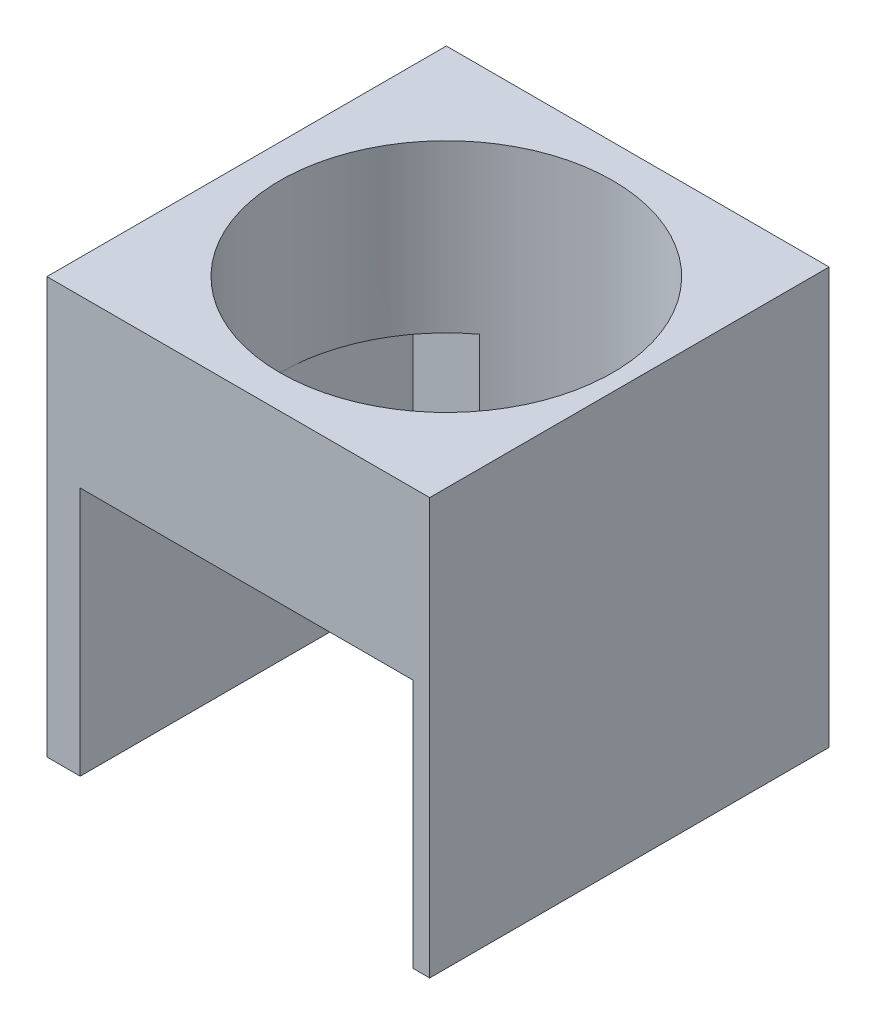
ISO-10303-21;
HEADER;
FILE_DESCRIPTION(('STEP AP214'),'2;1');
FILE_NAME('part.step','',(''),(''),'','','');
FILE_SCHEMA(('AUTOMOTIVE_DESIGN { 1 0 10303 214 1 1 1 1 }'));
ENDSEC;
DATA;
#1=APPLICATION_CONTEXT('core data for automotive mechanical design processes');
#2=APPLICATION_PROTOCOL_DEFINITION('international standard','automotive_design',2000,#1);
#3=PRODUCT_CONTEXT('',#1,'mechanical');
#4=PRODUCT('Part','Part','',(#3));
#5=PRODUCT_RELATED_PRODUCT_CATEGORY('part','',(#4));
#6=PRODUCT_DEFINITION_FORMATION('','',#4);
#7=PRODUCT_DEFINITION_CONTEXT('part definition',#1,'design');
#8=PRODUCT_DEFINITION('design','',#6,#7);
#9=PRODUCT_DEFINITION_SHAPE('','',#8);
#10=(LENGTH_UNIT() NAMED_UNIT(*) SI_UNIT(.MILLI.,.METRE.));
#11=(NAMED_UNIT(*) PLANE_ANGLE_UNIT() SI_UNIT($,.RADIAN.));
#12=(NAMED_UNIT(*) SI_UNIT($,.STERADIAN.) SOLID_ANGLE_UNIT());
#13=UNCERTAINTY_MEASURE_WITH_UNIT(LENGTH_MEASURE(1.E-05),#10,'distance_accuracy_value','');
#14=(GEOMETRIC_REPRESENTATION_CONTEXT(3) GLOBAL_UNCERTAINTY_ASSIGNED_CONTEXT((#13)) GLOBAL_UNIT_ASSIGNED_CONTEXT((#10,
#11,#12)) REPRESENTATION_CONTEXT('',''));
#15=CARTESIAN_POINT('',(0.,0.,0.));
#16=DIRECTION('',(0.,0.,1.));
#17=DIRECTION('',(1.,0.,0.));
#18=AXIS2_PLACEMENT_3D('',#15,#16,#17);
#19=CARTESIAN_POINT('',(0.,530.,0.));
#20=DIRECTION('',(0.,0.,-1.));
#21=DIRECTION('',(-1.,0.,0.));
#22=AXIS2_PLACEMENT_3D('',#19,#20,#21);
#23=PLANE('',#22);
#24=DIRECTION('',(0.,-1.,0.));
#25=VECTOR('',#24,1.);
#26=CARTESIAN_POINT('',(0.,530.,0.));
#27=LINE('',#26,#25);
#28=CARTESIAN_POINT('',(0.,530.,0.));
#29=VERTEX_POINT('',#28);
#30=CARTESIAN_POINT('',(0.,405.,0.));
#31=VERTEX_POINT('',#30);
#32=EDGE_CURVE('E143',#29,#31,#27,.T.);
#33=ORIENTED_EDGE('',*,*,#32,.T.);
#34=DIRECTION('',(1.,0.,0.));
#35=VECTOR('',#34,1.);
#36=CARTESIAN_POINT('',(0.,405.,0.));
#37=LINE('',#36,#35);
#38=CARTESIAN_POINT('',(9.99999999999982,405.,0.));
#39=VERTEX_POINT('',#38);
#40=EDGE_CURVE('E124',#31,#39,#37,.T.);
#41=ORIENTED_EDGE('',*,*,#40,.T.);
#42=DIRECTION('',(0.,-1.,0.));
#43=VECTOR('',#42,1.);
#44=CARTESIAN_POINT('',(9.99999999999982,280.,0.));
#45=LINE('',#44,#43);
#46=CARTESIAN_POINT('',(9.99999999999982,480.,0.));
#47=VERTEX_POINT('',#46);
#48=EDGE_CURVE('E186',#47,#39,#45,.T.);
#49=ORIENTED_EDGE('',*,*,#48,.F.);
#50=DIRECTION('',(-1.,0.,0.));
#51=VECTOR('',#50,1.);
#52=CARTESIAN_POINT('',(9.99999999999982,480.,0.));
#53=LINE('',#52,#51);
#54=CARTESIAN_POINT('',(110.,480.,0.));
#55=VERTEX_POINT('',#54);
#56=EDGE_CURVE('E200',#55,#47,#53,.T.);
#57=ORIENTED_EDGE('',*,*,#56,.F.);
#58=DIRECTION('',(0.,1.,0.));
#59=VECTOR('',#58,1.);
#60=CARTESIAN_POINT('',(110.,280.,0.));
#61=LINE('',#60,#59);
#62=CARTESIAN_POINT('',(110.,405.,0.));
#63=VERTEX_POINT('',#62);
#64=EDGE_CURVE('E194',#63,#55,#61,.T.);
#65=ORIENTED_EDGE('',*,*,#64,.F.);
#66=CARTESIAN_POINT('',(115.,405.,0.));
#67=VERTEX_POINT('',#66);
#68=EDGE_CURVE('E227',#63,#67,#37,.T.);
#69=ORIENTED_EDGE('',*,*,#68,.T.);
#70=DIRECTION('',(0.,1.,0.));
#71=VECTOR('',#70,1.);
#72=CARTESIAN_POINT('',(115.,530.,0.));
#73=LINE('',#72,#71);
#74=CARTESIAN_POINT('',(115.,530.,0.));
#75=VERTEX_POINT('',#74);
#76=EDGE_CURVE('E181',#67,#75,#73,.T.);
#77=ORIENTED_EDGE('',*,*,#76,.T.);
#78=DIRECTION('',(1.,0.,0.));
#79=VECTOR('',#78,1.);
#80=CARTESIAN_POINT('',(0.,530.,0.));
#81=LINE('',#80,#79);
#82=EDGE_CURVE('E148',#29,#75,#81,.T.);
#83=ORIENTED_EDGE('',*,*,#82,.F.);
#84=EDGE_LOOP('',(#33,#41,#49,#57,#65,#69,#77,#83));
#85=FACE_BOUND('',#84,.T.);
#86=ADVANCED_FACE('F38',(#85),#23,.F.);
#87=CARTESIAN_POINT('',(9.99999999999982,480.,-100.));
#88=DIRECTION('',(0.,1.,0.));
#89=DIRECTION('',(-1.,0.,0.));
#90=AXIS2_PLACEMENT_3D('',#87,#88,#89);
#91=PLANE('',#90);
#92=DIRECTION('',(0.,0.,1.));
#93=VECTOR('',#92,1.);
#94=CARTESIAN_POINT('',(110.,480.,-100.));
#95=LINE('',#94,#93);
#96=CARTESIAN_POINT('',(110.,480.,-100.));
#97=VERTEX_POINT('',#96);
#98=CARTESIAN_POINT('',(110.,480.,-60.));
#99=VERTEX_POINT('',#98);
#100=EDGE_CURVE('E172',#97,#99,#95,.T.);
#101=ORIENTED_EDGE('',*,*,#100,.T.);
#102=CARTESIAN_POINT('',(60.,480.,-60.));
#103=DIRECTION('',(0.,1.,0.));
#104=DIRECTION('',(-1.,0.,0.));
#105=AXIS2_PLACEMENT_3D('',#102,#103,#104);
#106=CIRCLE('',#105,50.);
#107=CARTESIAN_POINT('',(90.0000000000001,480.,-100.));
#108=VERTEX_POINT('',#107);
#109=EDGE_CURVE('E166',#99,#108,#106,.T.);
#110=ORIENTED_EDGE('',*,*,#109,.T.);
#111=DIRECTION('',(-1.,0.,0.));
#112=VECTOR('',#111,1.);
#113=CARTESIAN_POINT('',(9.99999999999982,480.,-100.));
#114=LINE('',#113,#112);
#115=EDGE_CURVE('E160',#97,#108,#114,.T.);
#116=ORIENTED_EDGE('',*,*,#115,.F.);
#117=EDGE_LOOP('',(#101,#110,#116));
#118=FACE_BOUND('',#117,.T.);
#119=ADVANCED_FACE('F170',(#118),#91,.F.);
#120=DIRECTION('',(0.,0.,1.));
#121=VECTOR('',#120,1.);
#122=CARTESIAN_POINT('',(9.99999999999982,480.,-100.));
#123=LINE('',#122,#121);
#124=CARTESIAN_POINT('',(9.99999999999982,480.,-60.));
#125=VERTEX_POINT('',#124);
#126=EDGE_CURVE('E213',#125,#47,#123,.T.);
#127=ORIENTED_EDGE('',*,*,#126,.F.);
#128=EDGE_CURVE('E174',#125,#99,#106,.T.);
#129=ORIENTED_EDGE('',*,*,#128,.T.);
#130=EDGE_CURVE('E216',#99,#55,#95,.T.);
#131=ORIENTED_EDGE('',*,*,#130,.T.);
#132=ORIENTED_EDGE('',*,*,#56,.T.);
#133=EDGE_LOOP('',(#127,#129,#131,#132));
#134=FACE_BOUND('',#133,.T.);
#135=ADVANCED_FACE('F262',(#134),#91,.F.);
#136=CARTESIAN_POINT('',(0.,0.,-100.));
#137=DIRECTION('',(0.,0.,-1.));
#138=DIRECTION('',(-1.,0.,0.));
#139=AXIS2_PLACEMENT_3D('',#136,#137,#138);
#140=PLANE('',#139);
#141=DIRECTION('',(0.,-1.,0.));
#142=VECTOR('',#141,1.);
#143=CARTESIAN_POINT('',(9.99999999999982,280.,-100.));
#144=LINE('',#143,#142);
#145=CARTESIAN_POINT('',(9.99999999999982,480.,-100.));
#146=VERTEX_POINT('',#145);
#147=CARTESIAN_POINT('',(9.99999999999982,405.,-100.));
#148=VERTEX_POINT('',#147);
#149=EDGE_CURVE('E208',#146,#148,#144,.T.);
#150=ORIENTED_EDGE('',*,*,#149,.T.);
#151=DIRECTION('',(1.,0.,0.));
#152=VECTOR('',#151,1.);
#153=CARTESIAN_POINT('',(0.,405.,-100.));
#154=LINE('',#153,#152);
#155=CARTESIAN_POINT('',(30.,405.,-100.));
#156=VERTEX_POINT('',#155);
#157=EDGE_CURVE('E242',#148,#156,#154,.T.);
#158=ORIENTED_EDGE('',*,*,#157,.T.);
#159=DIRECTION('',(0.,1.,0.));
#160=VECTOR('',#159,1.);
#161=CARTESIAN_POINT('',(30.,270.,-100.));
#162=LINE('',#161,#160);
#163=CARTESIAN_POINT('',(30.,480.,-100.));
#164=VERTEX_POINT('',#163);
#165=EDGE_CURVE('E11',#156,#164,#162,.T.);
#166=ORIENTED_EDGE('',*,*,#165,.T.);
#167=EDGE_CURVE('E265',#164,#146,#114,.T.);
#168=ORIENTED_EDGE('',*,*,#167,.T.);
#169=EDGE_LOOP('',(#150,#158,#166,#168));
#170=FACE_BOUND('',#169,.T.);
#171=ADVANCED_FACE('F272',(#170),#140,.F.);
#172=CARTESIAN_POINT('',(0.,530.,0.));
#173=DIRECTION('',(1.,0.,0.));
#174=DIRECTION('',(0.,0.,-1.));
#175=AXIS2_PLACEMENT_3D('',#172,#173,#174);
#176=PLANE('',#175);
#177=DIRECTION('',(0.,-1.,0.));
#178=VECTOR('',#177,1.);
#179=CARTESIAN_POINT('',(0.,530.,-120.));
#180=LINE('',#179,#178);
#181=CARTESIAN_POINT('',(0.,530.,-120.));
#182=VERTEX_POINT('',#181);
#183=CARTESIAN_POINT('',(0.,405.,-120.));
#184=VERTEX_POINT('',#183);
#185=EDGE_CURVE('E136',#182,#184,#180,.T.);
#186=ORIENTED_EDGE('',*,*,#185,.T.);
#187=DIRECTION('',(0.,0.,1.));
#188=VECTOR('',#187,1.);
#189=CARTESIAN_POINT('',(0.,405.,-120.));
#190=LINE('',#189,#188);
#191=EDGE_CURVE('E121',#184,#31,#190,.T.);
#192=ORIENTED_EDGE('',*,*,#191,.T.);
#193=ORIENTED_EDGE('',*,*,#32,.F.);
#194=DIRECTION('',(0.,0.,1.));
#195=VECTOR('',#194,1.);
#196=CARTESIAN_POINT('',(0.,530.,0.));
#197=LINE('',#196,#195);
#198=EDGE_CURVE('E141',#182,#29,#197,.T.);
#199=ORIENTED_EDGE('',*,*,#198,.F.);
#200=EDGE_LOOP('',(#186,#192,#193,#199));
#201=FACE_BOUND('',#200,.T.);
#202=ADVANCED_FACE('F40',(#201),#176,.F.);
#203=CARTESIAN_POINT('',(0.,530.,-120.));
#204=DIRECTION('',(0.,0.,1.));
#205=DIRECTION('',(1.,0.,0.));
#206=AXIS2_PLACEMENT_3D('',#203,#204,#205);
#207=PLANE('',#206);
#208=DIRECTION('',(0.,-1.,0.));
#209=VECTOR('',#208,1.);
#210=CARTESIAN_POINT('',(115.,280.,-120.));
#211=LINE('',#210,#209);
#212=CARTESIAN_POINT('',(115.,530.,-120.));
#213=VERTEX_POINT('',#212);
#214=CARTESIAN_POINT('',(115.,405.,-120.));
#215=VERTEX_POINT('',#214);
#216=EDGE_CURVE('E138',#213,#215,#211,.T.);
#217=ORIENTED_EDGE('',*,*,#216,.T.);
#218=DIRECTION('',(-1.,0.,0.));
#219=VECTOR('',#218,1.);
#220=CARTESIAN_POINT('',(0.,405.,-120.));
#221=LINE('',#220,#219);
#222=EDGE_CURVE('E54',#215,#184,#221,.T.);
#223=ORIENTED_EDGE('',*,*,#222,.T.);
#224=ORIENTED_EDGE('',*,*,#185,.F.);
#225=DIRECTION('',(-1.,0.,0.));
#226=VECTOR('',#225,1.);
#227=CARTESIAN_POINT('',(0.,530.,-120.));
#228=LINE('',#227,#226);
#229=EDGE_CURVE('E62',#213,#182,#228,.T.);
#230=ORIENTED_EDGE('',*,*,#229,.F.);
#231=EDGE_LOOP('',(#217,#223,#224,#230));
#232=FACE_BOUND('',#231,.T.);
#233=ADVANCED_FACE('F135',(#232),#207,.F.);
#234=CARTESIAN_POINT('',(0.,530.,0.));
#235=DIRECTION('',(0.,-1.,0.));
#236=DIRECTION('',(0.,0.,-1.));
#237=AXIS2_PLACEMENT_3D('',#234,#235,#236);
#238=PLANE('',#237);
#239=CARTESIAN_POINT('',(60.,530.,-60.));
#240=DIRECTION('',(0.,1.,0.));
#241=DIRECTION('',(0.,0.,1.));
#242=AXIS2_PLACEMENT_3D('',#239,#240,#241);
#243=CIRCLE('',#242,50.);
#244=CARTESIAN_POINT('',(60.,530.,-9.99999999999999));
#245=VERTEX_POINT('',#244);
#246=EDGE_CURVE('E175',#245,#245,#243,.T.);
#247=ORIENTED_EDGE('',*,*,#246,.F.);
#248=EDGE_LOOP('',(#247));
#249=FACE_BOUND('',#248,.T.);
#250=ORIENTED_EDGE('',*,*,#82,.T.);
#251=DIRECTION('',(0.,0.,1.));
#252=VECTOR('',#251,1.);
#253=CARTESIAN_POINT('',(115.,530.,-120.));
#254=LINE('',#253,#252);
#255=EDGE_CURVE('E222',#213,#75,#254,.T.);
#256=ORIENTED_EDGE('',*,*,#255,.F.);
#257=ORIENTED_EDGE('',*,*,#229,.T.);
#258=ORIENTED_EDGE('',*,*,#198,.T.);
#259=EDGE_LOOP('',(#250,#256,#257,#258));
#260=FACE_BOUND('',#259,.T.);
#261=ADVANCED_FACE('F220',(#249,#260),#238,.F.);
#262=CARTESIAN_POINT('',(9.99999999999982,280.,-100.));
#263=DIRECTION('',(-1.,0.,0.));
#264=DIRECTION('',(0.,0.,1.));
#265=AXIS2_PLACEMENT_3D('',#262,#263,#264);
#266=PLANE('',#265);
#267=ORIENTED_EDGE('',*,*,#48,.T.);
#268=DIRECTION('',(0.,0.,-1.));
#269=VECTOR('',#268,1.);
#270=CARTESIAN_POINT('',(9.99999999999982,405.,-100.));
#271=LINE('',#270,#269);
#272=EDGE_CURVE('E237',#39,#148,#271,.T.);
#273=ORIENTED_EDGE('',*,*,#272,.T.);
#274=ORIENTED_EDGE('',*,*,#149,.F.);
#275=EDGE_CURVE('E209',#146,#125,#123,.T.);
#276=ORIENTED_EDGE('',*,*,#275,.T.);
#277=ORIENTED_EDGE('',*,*,#126,.T.);
#278=EDGE_LOOP('',(#267,#273,#274,#276,#277));
#279=FACE_BOUND('',#278,.T.);
#280=ADVANCED_FACE('F273',(#279),#266,.F.);
#281=ORIENTED_EDGE('',*,*,#167,.F.);
#282=EDGE_CURVE('E177',#164,#125,#106,.T.);
#283=ORIENTED_EDGE('',*,*,#282,.T.);
#284=ORIENTED_EDGE('',*,*,#275,.F.);
#285=EDGE_LOOP('',(#281,#283,#284));
#286=FACE_BOUND('',#285,.T.);
#287=ADVANCED_FACE('F275',(#286),#91,.F.);
#288=CARTESIAN_POINT('',(110.,280.,-100.));
#289=DIRECTION('',(1.,0.,0.));
#290=DIRECTION('',(0.,0.,-1.));
#291=AXIS2_PLACEMENT_3D('',#288,#289,#290);
#292=PLANE('',#291);
#293=DIRECTION('',(0.,1.,0.));
#294=VECTOR('',#293,1.);
#295=CARTESIAN_POINT('',(110.,280.,-100.));
#296=LINE('',#295,#294);
#297=CARTESIAN_POINT('',(110.,405.,-100.));
#298=VERTEX_POINT('',#297);
#299=EDGE_CURVE('E259',#298,#97,#296,.T.);
#300=ORIENTED_EDGE('',*,*,#299,.F.);
#301=DIRECTION('',(0.,0.,1.));
#302=VECTOR('',#301,1.);
#303=CARTESIAN_POINT('',(110.,405.,-100.));
#304=LINE('',#303,#302);
#305=EDGE_CURVE('E246',#298,#63,#304,.T.);
#306=ORIENTED_EDGE('',*,*,#305,.T.);
#307=ORIENTED_EDGE('',*,*,#64,.T.);
#308=ORIENTED_EDGE('',*,*,#130,.F.);
#309=ORIENTED_EDGE('',*,*,#100,.F.);
#310=EDGE_LOOP('',(#300,#306,#307,#308,#309));
#311=FACE_BOUND('',#310,.T.);
#312=ADVANCED_FACE('F256',(#311),#292,.F.);
#313=DIRECTION('',(0.,1.,0.));
#314=VECTOR('',#313,1.);
#315=CARTESIAN_POINT('',(90.0000000000001,270.,-100.));
#316=LINE('',#315,#314);
#317=CARTESIAN_POINT('',(90.0000000000001,405.,-100.));
#318=VERTEX_POINT('',#317);
#319=EDGE_CURVE('E47',#108,#318,#316,.F.);
#320=ORIENTED_EDGE('',*,*,#319,.T.);
#321=DIRECTION('',(1.,0.,0.));
#322=VECTOR('',#321,1.);
#323=CARTESIAN_POINT('',(0.,405.,-100.));
#324=LINE('',#323,#322);
#325=EDGE_CURVE('E157',#318,#298,#324,.T.);
#326=ORIENTED_EDGE('',*,*,#325,.T.);
#327=ORIENTED_EDGE('',*,*,#299,.T.);
#328=ORIENTED_EDGE('',*,*,#115,.T.);
#329=EDGE_LOOP('',(#320,#326,#327,#328));
#330=FACE_BOUND('',#329,.T.);
#331=ADVANCED_FACE('F156',(#330),#140,.F.);
#332=CARTESIAN_POINT('',(60.,270.,-60.));
#333=DIRECTION('',(0.,1.,0.));
#334=DIRECTION('',(0.,0.,1.));
#335=AXIS2_PLACEMENT_3D('',#332,#333,#334);
#336=CYLINDRICAL_SURFACE('',#335,50.);
#337=ORIENTED_EDGE('',*,*,#246,.T.);
#338=EDGE_LOOP('',(#337));
#339=FACE_BOUND('',#338,.T.);
#340=ORIENTED_EDGE('',*,*,#165,.F.);
#341=CARTESIAN_POINT('',(60.,405.,-60.));
#342=DIRECTION('',(0.,1.,0.));
#343=DIRECTION('',(0.,0.,1.));
#344=AXIS2_PLACEMENT_3D('',#341,#342,#343);
#345=CIRCLE('',#344,50.);
#346=EDGE_CURVE('E130',#156,#318,#345,.F.);
#347=ORIENTED_EDGE('',*,*,#346,.T.);
#348=ORIENTED_EDGE('',*,*,#319,.F.);
#349=ORIENTED_EDGE('',*,*,#109,.F.);
#350=ORIENTED_EDGE('',*,*,#128,.F.);
#351=ORIENTED_EDGE('',*,*,#282,.F.);
#352=EDGE_LOOP('',(#340,#347,#348,#349,#350,#351));
#353=FACE_BOUND('',#352,.T.);
#354=ADVANCED_FACE('F165',(#339,#353),#336,.F.);
#355=CARTESIAN_POINT('',(115.,280.,-120.));
#356=DIRECTION('',(-1.,0.,0.));
#357=DIRECTION('',(0.,-1.,0.));
#358=AXIS2_PLACEMENT_3D('',#355,#356,#357);
#359=PLANE('',#358);
#360=ORIENTED_EDGE('',*,*,#76,.F.);
#361=DIRECTION('',(0.,0.,1.));
#362=VECTOR('',#361,1.);
#363=CARTESIAN_POINT('',(115.,405.,-120.));
#364=LINE('',#363,#362);
#365=EDGE_CURVE('E131',#215,#67,#364,.T.);
#366=ORIENTED_EDGE('',*,*,#365,.F.);
#367=ORIENTED_EDGE('',*,*,#216,.F.);
#368=ORIENTED_EDGE('',*,*,#255,.T.);
#369=EDGE_LOOP('',(#360,#366,#367,#368));
#370=FACE_BOUND('',#369,.T.);
#371=ADVANCED_FACE('F231',(#370),#359,.F.);
#372=CARTESIAN_POINT('',(0.,405.,-120.));
#373=DIRECTION('',(0.,1.,0.));
#374=DIRECTION('',(0.,0.,1.));
#375=AXIS2_PLACEMENT_3D('',#372,#373,#374);
#376=PLANE('',#375);
#377=ORIENTED_EDGE('',*,*,#191,.F.);
#378=ORIENTED_EDGE('',*,*,#222,.F.);
#379=ORIENTED_EDGE('',*,*,#365,.T.);
#380=ORIENTED_EDGE('',*,*,#68,.F.);
#381=ORIENTED_EDGE('',*,*,#305,.F.);
#382=ORIENTED_EDGE('',*,*,#325,.F.);
#383=ORIENTED_EDGE('',*,*,#346,.F.);
#384=ORIENTED_EDGE('',*,*,#157,.F.);
#385=ORIENTED_EDGE('',*,*,#272,.F.);
#386=ORIENTED_EDGE('',*,*,#40,.F.);
#387=EDGE_LOOP('',(#377,#378,#379,#380,#381,#382,#383,#384,#385,#386));
#388=FACE_BOUND('',#387,.T.);
#389=ADVANCED_FACE('F122',(#388),#376,.F.);
#390=CLOSED_SHELL('',(#86,#119,#135,#171,#202,#233,#261,#280,#287,#312,#331,#354,#371,#389));
#391=MANIFOLD_SOLID_BREP('B2',#390);
#392=ADVANCED_BREP_SHAPE_REPRESENTATION('',(#18,#391),#14);
#393=SHAPE_DEFINITION_REPRESENTATION(#9,#392);
ENDSEC;
END-ISO-10303-21;
